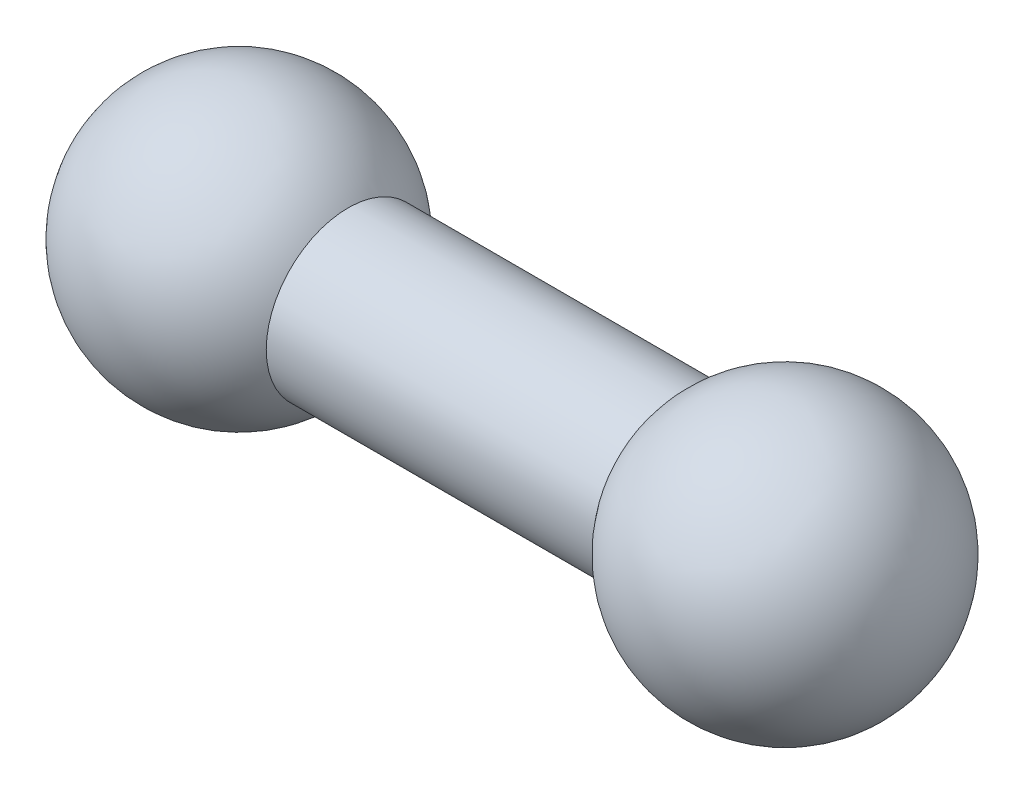
ISO-10303-21;
HEADER;
FILE_DESCRIPTION(('STEP AP214'),'2;1');
FILE_NAME('part.step','',(''),(''),'','','');
FILE_SCHEMA(('AUTOMOTIVE_DESIGN { 1 0 10303 214 1 1 1 1 }'));
ENDSEC;
DATA;
#1=APPLICATION_CONTEXT('core data for automotive mechanical design processes');
#2=APPLICATION_PROTOCOL_DEFINITION('international standard','automotive_design',2000,#1);
#3=PRODUCT_CONTEXT('',#1,'mechanical');
#4=PRODUCT('Part','Part','',(#3));
#5=PRODUCT_RELATED_PRODUCT_CATEGORY('part','',(#4));
#6=PRODUCT_DEFINITION_FORMATION('','',#4);
#7=PRODUCT_DEFINITION_CONTEXT('part definition',#1,'design');
#8=PRODUCT_DEFINITION('design','',#6,#7);
#9=PRODUCT_DEFINITION_SHAPE('','',#8);
#10=(LENGTH_UNIT() NAMED_UNIT(*) SI_UNIT(.MILLI.,.METRE.));
#11=(NAMED_UNIT(*) PLANE_ANGLE_UNIT() SI_UNIT($,.RADIAN.));
#12=(NAMED_UNIT(*) SI_UNIT($,.STERADIAN.) SOLID_ANGLE_UNIT());
#13=UNCERTAINTY_MEASURE_WITH_UNIT(LENGTH_MEASURE(1.E-05),#10,'distance_accuracy_value','');
#14=(GEOMETRIC_REPRESENTATION_CONTEXT(3) GLOBAL_UNCERTAINTY_ASSIGNED_CONTEXT((#13)) GLOBAL_UNIT_ASSIGNED_CONTEXT((#10,
#11,#12)) REPRESENTATION_CONTEXT('',''));
#15=CARTESIAN_POINT('',(0.,0.,0.));
#16=DIRECTION('',(0.,0.,1.));
#17=DIRECTION('',(1.,0.,0.));
#18=AXIS2_PLACEMENT_3D('',#15,#16,#17);
#19=CARTESIAN_POINT('',(10.,0.,-2.5));
#20=DIRECTION('',(-1.,0.,0.));
#21=DIRECTION('',(0.,0.,1.));
#22=AXIS2_PLACEMENT_3D('',#19,#20,#21);
#23=CYLINDRICAL_SURFACE('',#22,1.5);
#24=CARTESIAN_POINT('',(2.,0.,-2.5));
#25=DIRECTION('',(-1.,0.,0.));
#26=DIRECTION('',(0.,0.,1.));
#27=AXIS2_PLACEMENT_3D('',#24,#25,#26);
#28=CIRCLE('',#27,1.5);
#29=CARTESIAN_POINT('',(2.,0.,-1.));
#30=VERTEX_POINT('',#29);
#31=EDGE_CURVE('E43',#30,#30,#28,.T.);
#32=ORIENTED_EDGE('',*,*,#31,.F.);
#33=EDGE_LOOP('',(#32));
#34=FACE_BOUND('',#33,.T.);
#35=CARTESIAN_POINT('',(8.,0.,-2.5));
#36=DIRECTION('',(1.,0.,0.));
#37=DIRECTION('',(0.,0.,-1.));
#38=AXIS2_PLACEMENT_3D('',#35,#36,#37);
#39=CIRCLE('',#38,1.5);
#40=CARTESIAN_POINT('',(8.,0.,-4.));
#41=VERTEX_POINT('',#40);
#42=EDGE_CURVE('E10',#41,#41,#39,.F.);
#43=ORIENTED_EDGE('',*,*,#42,.T.);
#44=EDGE_LOOP('',(#43));
#45=FACE_BOUND('',#44,.T.);
#46=ADVANCED_FACE('F36',(#34,#45),#23,.T.);
#47=CARTESIAN_POINT('',(0.,0.,-2.5));
#48=DIRECTION('',(0.,1.,0.));
#49=DIRECTION('',(0.,0.,1.));
#50=AXIS2_PLACEMENT_3D('',#47,#48,#49);
#51=SPHERICAL_SURFACE('',#50,2.5);
#52=CARTESIAN_POINT('',(0.,0.,-2.5));
#53=DIRECTION('',(-1.,0.,0.));
#54=DIRECTION('',(0.,0.,1.));
#55=AXIS2_PLACEMENT_3D('',#52,#53,#54);
#56=SPHERICAL_SURFACE('',#55,2.5);
#57=ORIENTED_EDGE('',*,*,#31,.T.);
#58=EDGE_LOOP('',(#57));
#59=FACE_BOUND('',#58,.T.);
#60=ADVANCED_FACE('F38',(#59),#56,.T.);
#61=CARTESIAN_POINT('',(10.,0.,-2.5));
#62=DIRECTION('',(0.,1.,0.));
#63=DIRECTION('',(0.,0.,1.));
#64=AXIS2_PLACEMENT_3D('',#61,#62,#63);
#65=SPHERICAL_SURFACE('',#64,2.5);
#66=CARTESIAN_POINT('',(10.,0.,-2.5));
#67=DIRECTION('',(1.,0.,0.));
#68=DIRECTION('',(0.,0.,-1.));
#69=AXIS2_PLACEMENT_3D('',#66,#67,#68);
#70=SPHERICAL_SURFACE('',#69,2.5);
#71=ORIENTED_EDGE('',*,*,#42,.F.);
#72=EDGE_LOOP('',(#71));
#73=FACE_BOUND('',#72,.T.);
#74=ADVANCED_FACE('F54',(#73),#70,.T.);
#75=CLOSED_SHELL('',(#46,#60,#74));
#76=MANIFOLD_SOLID_BREP('B2',#75);
#77=ADVANCED_BREP_SHAPE_REPRESENTATION('',(#18,#76),#14);
#78=SHAPE_DEFINITION_REPRESENTATION(#9,#77);
ENDSEC;
END-ISO-10303-21;
